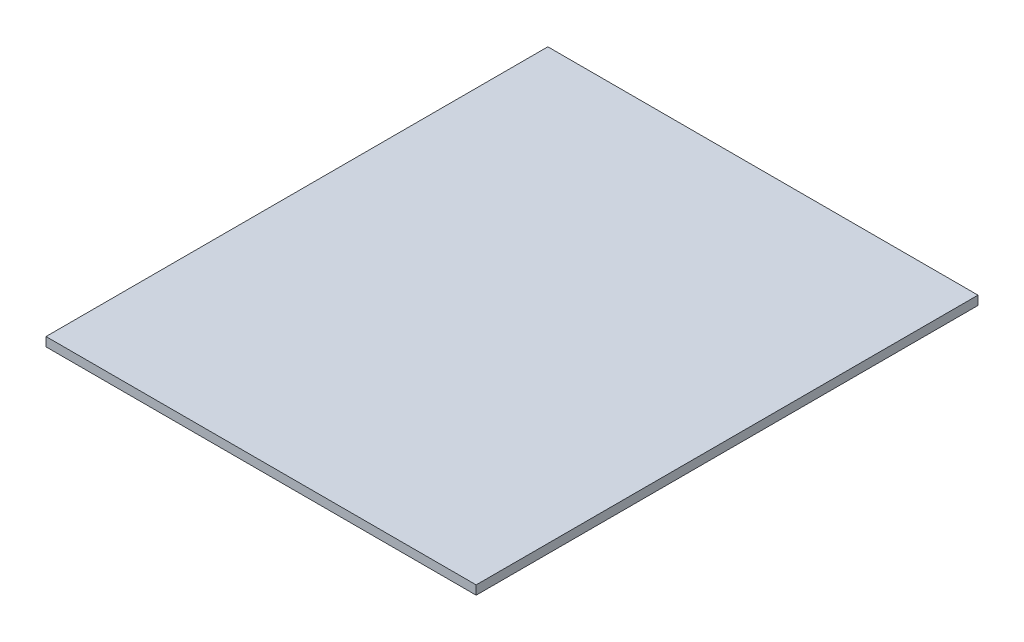
ISO-10303-21;
HEADER;
FILE_DESCRIPTION(('STEP AP214'),'2;1');
FILE_NAME('part.step','',(''),(''),'','','');
FILE_SCHEMA(('AUTOMOTIVE_DESIGN { 1 0 10303 214 1 1 1 1 }'));
ENDSEC;
DATA;
#1=APPLICATION_CONTEXT('core data for automotive mechanical design processes');
#2=APPLICATION_PROTOCOL_DEFINITION('international standard','automotive_design',2000,#1);
#3=PRODUCT_CONTEXT('',#1,'mechanical');
#4=PRODUCT('Part','Part','',(#3));
#5=PRODUCT_RELATED_PRODUCT_CATEGORY('part','',(#4));
#6=PRODUCT_DEFINITION_FORMATION('','',#4);
#7=PRODUCT_DEFINITION_CONTEXT('part definition',#1,'design');
#8=PRODUCT_DEFINITION('design','',#6,#7);
#9=PRODUCT_DEFINITION_SHAPE('','',#8);
#10=(LENGTH_UNIT() NAMED_UNIT(*) SI_UNIT(.MILLI.,.METRE.));
#11=(NAMED_UNIT(*) PLANE_ANGLE_UNIT() SI_UNIT($,.RADIAN.));
#12=(NAMED_UNIT(*) SI_UNIT($,.STERADIAN.) SOLID_ANGLE_UNIT());
#13=UNCERTAINTY_MEASURE_WITH_UNIT(LENGTH_MEASURE(1.E-05),#10,'distance_accuracy_value','');
#14=(GEOMETRIC_REPRESENTATION_CONTEXT(3) GLOBAL_UNCERTAINTY_ASSIGNED_CONTEXT((#13)) GLOBAL_UNIT_ASSIGNED_CONTEXT((#10,
#11,#12)) REPRESENTATION_CONTEXT('',''));
#15=CARTESIAN_POINT('',(0.,0.,0.));
#16=DIRECTION('',(0.,0.,1.));
#17=DIRECTION('',(1.,0.,0.));
#18=AXIS2_PLACEMENT_3D('',#15,#16,#17);
#19=CARTESIAN_POINT('',(0.,3.175,0.));
#20=DIRECTION('',(1.,0.,0.));
#21=DIRECTION('',(0.,0.,-1.));
#22=AXIS2_PLACEMENT_3D('',#19,#20,#21);
#23=PLANE('',#22);
#24=DIRECTION('',(0.,0.,1.));
#25=VECTOR('',#24,1.);
#26=CARTESIAN_POINT('',(0.,0.,0.));
#27=LINE('',#26,#25);
#28=CARTESIAN_POINT('',(0.,0.,-177.8));
#29=VERTEX_POINT('',#28);
#30=CARTESIAN_POINT('',(0.,0.,0.));
#31=VERTEX_POINT('',#30);
#32=EDGE_CURVE('E113',#29,#31,#27,.T.);
#33=ORIENTED_EDGE('',*,*,#32,.T.);
#34=DIRECTION('',(0.,-1.,0.));
#35=VECTOR('',#34,1.);
#36=CARTESIAN_POINT('',(0.,3.175,0.));
#37=LINE('',#36,#35);
#38=CARTESIAN_POINT('',(0.,3.175,0.));
#39=VERTEX_POINT('',#38);
#40=EDGE_CURVE('E11',#39,#31,#37,.T.);
#41=ORIENTED_EDGE('',*,*,#40,.F.);
#42=DIRECTION('',(0.,0.,1.));
#43=VECTOR('',#42,1.);
#44=CARTESIAN_POINT('',(0.,3.175,0.));
#45=LINE('',#44,#43);
#46=CARTESIAN_POINT('',(0.,3.175,-177.8));
#47=VERTEX_POINT('',#46);
#48=EDGE_CURVE('E97',#47,#39,#45,.T.);
#49=ORIENTED_EDGE('',*,*,#48,.F.);
#50=DIRECTION('',(0.,-1.,0.));
#51=VECTOR('',#50,1.);
#52=CARTESIAN_POINT('',(0.,3.175,-177.8));
#53=LINE('',#52,#51);
#54=EDGE_CURVE('E109',#47,#29,#53,.T.);
#55=ORIENTED_EDGE('',*,*,#54,.T.);
#56=EDGE_LOOP('',(#33,#41,#49,#55));
#57=FACE_BOUND('',#56,.T.);
#58=ADVANCED_FACE('F45',(#57),#23,.F.);
#59=CARTESIAN_POINT('',(0.,3.175,0.));
#60=DIRECTION('',(0.,0.,-1.));
#61=DIRECTION('',(-1.,0.,0.));
#62=AXIS2_PLACEMENT_3D('',#59,#60,#61);
#63=PLANE('',#62);
#64=DIRECTION('',(1.,0.,0.));
#65=VECTOR('',#64,1.);
#66=CARTESIAN_POINT('',(0.,0.,0.));
#67=LINE('',#66,#65);
#68=CARTESIAN_POINT('',(152.4,0.,0.));
#69=VERTEX_POINT('',#68);
#70=EDGE_CURVE('E102',#31,#69,#67,.T.);
#71=ORIENTED_EDGE('',*,*,#70,.T.);
#72=DIRECTION('',(0.,-1.,0.));
#73=VECTOR('',#72,1.);
#74=CARTESIAN_POINT('',(152.4,3.175,0.));
#75=LINE('',#74,#73);
#76=CARTESIAN_POINT('',(152.4,3.175,0.));
#77=VERTEX_POINT('',#76);
#78=EDGE_CURVE('E54',#77,#69,#75,.T.);
#79=ORIENTED_EDGE('',*,*,#78,.F.);
#80=DIRECTION('',(1.,0.,0.));
#81=VECTOR('',#80,1.);
#82=CARTESIAN_POINT('',(0.,3.175,0.));
#83=LINE('',#82,#81);
#84=EDGE_CURVE('E92',#39,#77,#83,.T.);
#85=ORIENTED_EDGE('',*,*,#84,.F.);
#86=ORIENTED_EDGE('',*,*,#40,.T.);
#87=EDGE_LOOP('',(#71,#79,#85,#86));
#88=FACE_BOUND('',#87,.T.);
#89=ADVANCED_FACE('F101',(#88),#63,.F.);
#90=CARTESIAN_POINT('',(152.4,3.175,0.));
#91=DIRECTION('',(-1.,0.,0.));
#92=DIRECTION('',(0.,0.,1.));
#93=AXIS2_PLACEMENT_3D('',#90,#91,#92);
#94=PLANE('',#93);
#95=DIRECTION('',(0.,0.,-1.));
#96=VECTOR('',#95,1.);
#97=CARTESIAN_POINT('',(152.4,0.,0.));
#98=LINE('',#97,#96);
#99=CARTESIAN_POINT('',(152.4,0.,-177.8));
#100=VERTEX_POINT('',#99);
#101=EDGE_CURVE('E79',#69,#100,#98,.T.);
#102=ORIENTED_EDGE('',*,*,#101,.T.);
#103=DIRECTION('',(0.,-1.,0.));
#104=VECTOR('',#103,1.);
#105=CARTESIAN_POINT('',(152.4,3.175,-177.8));
#106=LINE('',#105,#104);
#107=CARTESIAN_POINT('',(152.4,3.175,-177.8));
#108=VERTEX_POINT('',#107);
#109=EDGE_CURVE('E104',#108,#100,#106,.T.);
#110=ORIENTED_EDGE('',*,*,#109,.F.);
#111=DIRECTION('',(0.,0.,-1.));
#112=VECTOR('',#111,1.);
#113=CARTESIAN_POINT('',(152.4,3.175,0.));
#114=LINE('',#113,#112);
#115=EDGE_CURVE('E95',#77,#108,#114,.T.);
#116=ORIENTED_EDGE('',*,*,#115,.F.);
#117=ORIENTED_EDGE('',*,*,#78,.T.);
#118=EDGE_LOOP('',(#102,#110,#116,#117));
#119=FACE_BOUND('',#118,.T.);
#120=ADVANCED_FACE('F105',(#119),#94,.F.);
#121=CARTESIAN_POINT('',(0.,3.175,-177.8));
#122=DIRECTION('',(0.,0.,1.));
#123=DIRECTION('',(1.,0.,0.));
#124=AXIS2_PLACEMENT_3D('',#121,#122,#123);
#125=PLANE('',#124);
#126=DIRECTION('',(-1.,0.,0.));
#127=VECTOR('',#126,1.);
#128=CARTESIAN_POINT('',(0.,0.,-177.8));
#129=LINE('',#128,#127);
#130=EDGE_CURVE('E85',#100,#29,#129,.T.);
#131=ORIENTED_EDGE('',*,*,#130,.T.);
#132=ORIENTED_EDGE('',*,*,#54,.F.);
#133=DIRECTION('',(-1.,0.,0.));
#134=VECTOR('',#133,1.);
#135=CARTESIAN_POINT('',(0.,3.175,-177.8));
#136=LINE('',#135,#134);
#137=EDGE_CURVE('E62',#108,#47,#136,.T.);
#138=ORIENTED_EDGE('',*,*,#137,.F.);
#139=ORIENTED_EDGE('',*,*,#109,.T.);
#140=EDGE_LOOP('',(#131,#132,#138,#139));
#141=FACE_BOUND('',#140,.T.);
#142=ADVANCED_FACE('F126',(#141),#125,.F.);
#143=CARTESIAN_POINT('',(0.,3.175,0.));
#144=DIRECTION('',(0.,-1.,0.));
#145=DIRECTION('',(0.,0.,-1.));
#146=AXIS2_PLACEMENT_3D('',#143,#144,#145);
#147=PLANE('',#146);
#148=ORIENTED_EDGE('',*,*,#48,.T.);
#149=ORIENTED_EDGE('',*,*,#84,.T.);
#150=ORIENTED_EDGE('',*,*,#115,.T.);
#151=ORIENTED_EDGE('',*,*,#137,.T.);
#152=EDGE_LOOP('',(#148,#149,#150,#151));
#153=FACE_BOUND('',#152,.T.);
#154=ADVANCED_FACE('F93',(#153),#147,.F.);
#155=CARTESIAN_POINT('',(0.,0.,0.));
#156=DIRECTION('',(0.,-1.,0.));
#157=DIRECTION('',(0.,0.,-1.));
#158=AXIS2_PLACEMENT_3D('',#155,#156,#157);
#159=PLANE('',#158);
#160=ORIENTED_EDGE('',*,*,#32,.F.);
#161=ORIENTED_EDGE('',*,*,#130,.F.);
#162=ORIENTED_EDGE('',*,*,#101,.F.);
#163=ORIENTED_EDGE('',*,*,#70,.F.);
#164=EDGE_LOOP('',(#160,#161,#162,#163));
#165=FACE_BOUND('',#164,.T.);
#166=ADVANCED_FACE('F129',(#165),#159,.T.);
#167=CLOSED_SHELL('',(#58,#89,#120,#142,#154,#166));
#168=MANIFOLD_SOLID_BREP('B2',#167);
#169=ADVANCED_BREP_SHAPE_REPRESENTATION('',(#18,#168),#14);
#170=SHAPE_DEFINITION_REPRESENTATION(#9,#169);
ENDSEC;
END-ISO-10303-21;
